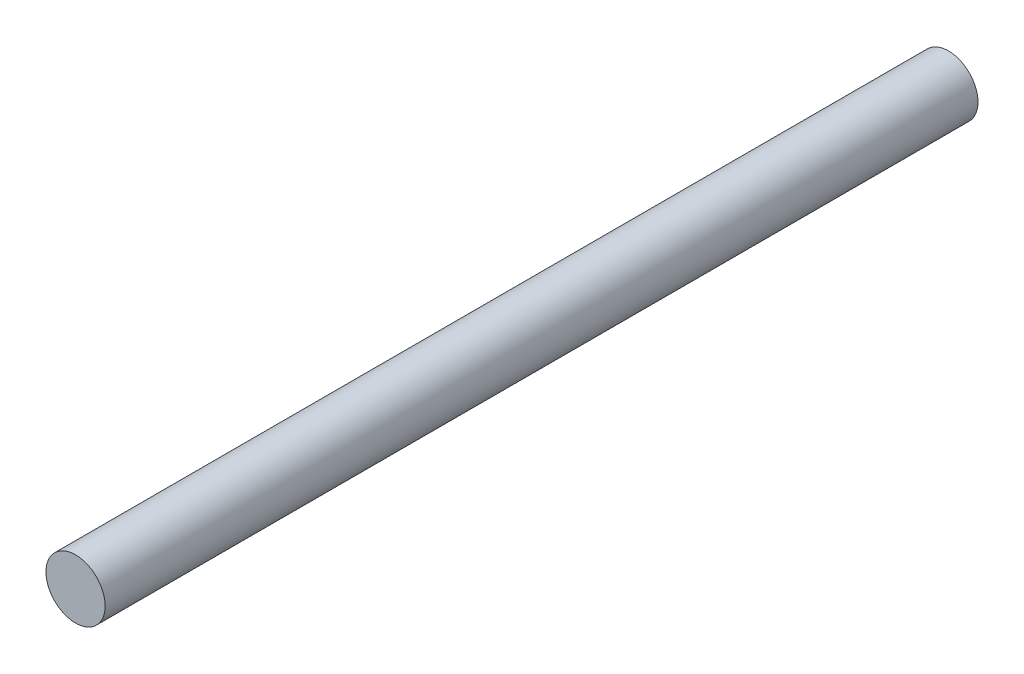
ISO-10303-21;
HEADER;
FILE_DESCRIPTION(('STEP AP214'),'2;1');
FILE_NAME('part.step','',(''),(''),'','','');
FILE_SCHEMA(('AUTOMOTIVE_DESIGN { 1 0 10303 214 1 1 1 1 }'));
ENDSEC;
DATA;
#1=APPLICATION_CONTEXT('core data for automotive mechanical design processes');
#2=APPLICATION_PROTOCOL_DEFINITION('international standard','automotive_design',2000,#1);
#3=PRODUCT_CONTEXT('',#1,'mechanical');
#4=PRODUCT('Part','Part','',(#3));
#5=PRODUCT_RELATED_PRODUCT_CATEGORY('part','',(#4));
#6=PRODUCT_DEFINITION_FORMATION('','',#4);
#7=PRODUCT_DEFINITION_CONTEXT('part definition',#1,'design');
#8=PRODUCT_DEFINITION('design','',#6,#7);
#9=PRODUCT_DEFINITION_SHAPE('','',#8);
#10=(LENGTH_UNIT() NAMED_UNIT(*) SI_UNIT(.MILLI.,.METRE.));
#11=(NAMED_UNIT(*) PLANE_ANGLE_UNIT() SI_UNIT($,.RADIAN.));
#12=(NAMED_UNIT(*) SI_UNIT($,.STERADIAN.) SOLID_ANGLE_UNIT());
#13=UNCERTAINTY_MEASURE_WITH_UNIT(LENGTH_MEASURE(1.E-05),#10,'distance_accuracy_value','');
#14=(GEOMETRIC_REPRESENTATION_CONTEXT(3) GLOBAL_UNCERTAINTY_ASSIGNED_CONTEXT((#13)) GLOBAL_UNIT_ASSIGNED_CONTEXT((#10,
#11,#12)) REPRESENTATION_CONTEXT('',''));
#15=CARTESIAN_POINT('',(0.,0.,0.));
#16=DIRECTION('',(0.,0.,1.));
#17=DIRECTION('',(1.,0.,0.));
#18=AXIS2_PLACEMENT_3D('',#15,#16,#17);
#19=CARTESIAN_POINT('',(0.,0.,88.5));
#20=DIRECTION('',(0.,0.,-1.));
#21=DIRECTION('',(-1.,0.,0.));
#22=AXIS2_PLACEMENT_3D('',#19,#20,#21);
#23=CYLINDRICAL_SURFACE('',#22,3.);
#24=CARTESIAN_POINT('',(0.,0.,88.5));
#25=DIRECTION('',(0.,0.,1.));
#26=DIRECTION('',(1.,0.,0.));
#27=AXIS2_PLACEMENT_3D('',#24,#25,#26);
#28=CIRCLE('',#27,3.);
#29=CARTESIAN_POINT('',(3.,0.,88.5));
#30=VERTEX_POINT('',#29);
#31=EDGE_CURVE('E10',#30,#30,#28,.T.);
#32=ORIENTED_EDGE('',*,*,#31,.F.);
#33=EDGE_LOOP('',(#32));
#34=FACE_BOUND('',#33,.T.);
#35=CARTESIAN_POINT('',(0.,0.,0.));
#36=DIRECTION('',(0.,0.,1.));
#37=DIRECTION('',(1.,0.,0.));
#38=AXIS2_PLACEMENT_3D('',#35,#36,#37);
#39=CIRCLE('',#38,3.);
#40=CARTESIAN_POINT('',(3.,0.,0.));
#41=VERTEX_POINT('',#40);
#42=EDGE_CURVE('E33',#41,#41,#39,.T.);
#43=ORIENTED_EDGE('',*,*,#42,.T.);
#44=EDGE_LOOP('',(#43));
#45=FACE_BOUND('',#44,.T.);
#46=ADVANCED_FACE('F30',(#34,#45),#23,.T.);
#47=CARTESIAN_POINT('',(0.,0.,88.5));
#48=DIRECTION('',(0.,0.,1.));
#49=DIRECTION('',(1.,0.,0.));
#50=AXIS2_PLACEMENT_3D('',#47,#48,#49);
#51=PLANE('',#50);
#52=ORIENTED_EDGE('',*,*,#31,.T.);
#53=EDGE_LOOP('',(#52));
#54=FACE_BOUND('',#53,.T.);
#55=ADVANCED_FACE('F45',(#54),#51,.T.);
#56=CARTESIAN_POINT('',(0.,0.,0.));
#57=DIRECTION('',(0.,0.,1.));
#58=DIRECTION('',(1.,0.,0.));
#59=AXIS2_PLACEMENT_3D('',#56,#57,#58);
#60=PLANE('',#59);
#61=ORIENTED_EDGE('',*,*,#42,.F.);
#62=EDGE_LOOP('',(#61));
#63=FACE_BOUND('',#62,.T.);
#64=ADVANCED_FACE('F43',(#63),#60,.F.);
#65=CLOSED_SHELL('',(#46,#55,#64));
#66=MANIFOLD_SOLID_BREP('B2',#65);
#67=ADVANCED_BREP_SHAPE_REPRESENTATION('',(#18,#66),#14);
#68=SHAPE_DEFINITION_REPRESENTATION(#9,#67);
ENDSEC;
END-ISO-10303-21;
